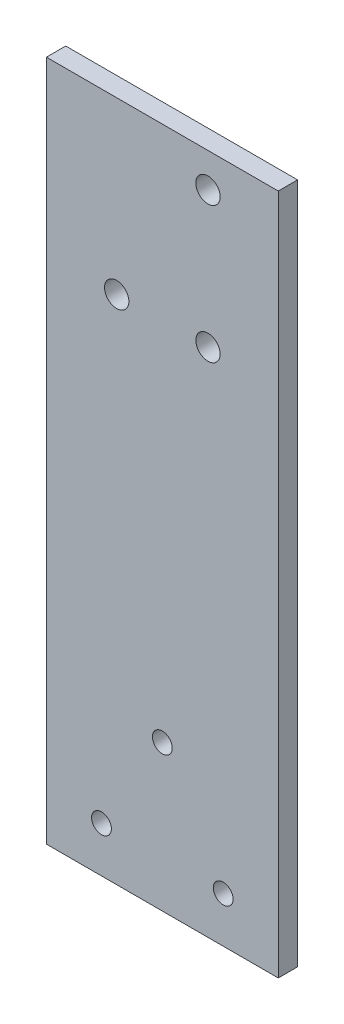
ISO-10303-21;
HEADER;
FILE_DESCRIPTION(('STEP AP214'),'2;1');
FILE_NAME('part.step','',(''),(''),'','','');
FILE_SCHEMA(('AUTOMOTIVE_DESIGN { 1 0 10303 214 1 1 1 1 }'));
ENDSEC;
DATA;
#1=APPLICATION_CONTEXT('core data for automotive mechanical design processes');
#2=APPLICATION_PROTOCOL_DEFINITION('international standard','automotive_design',2000,#1);
#3=PRODUCT_CONTEXT('',#1,'mechanical');
#4=PRODUCT('Part','Part','',(#3));
#5=PRODUCT_RELATED_PRODUCT_CATEGORY('part','',(#4));
#6=PRODUCT_DEFINITION_FORMATION('','',#4);
#7=PRODUCT_DEFINITION_CONTEXT('part definition',#1,'design');
#8=PRODUCT_DEFINITION('design','',#6,#7);
#9=PRODUCT_DEFINITION_SHAPE('','',#8);
#10=(LENGTH_UNIT() NAMED_UNIT(*) SI_UNIT(.MILLI.,.METRE.));
#11=(NAMED_UNIT(*) PLANE_ANGLE_UNIT() SI_UNIT($,.RADIAN.));
#12=(NAMED_UNIT(*) SI_UNIT($,.STERADIAN.) SOLID_ANGLE_UNIT());
#13=UNCERTAINTY_MEASURE_WITH_UNIT(LENGTH_MEASURE(1.E-05),#10,'distance_accuracy_value','');
#14=(GEOMETRIC_REPRESENTATION_CONTEXT(3) GLOBAL_UNCERTAINTY_ASSIGNED_CONTEXT((#13)) GLOBAL_UNIT_ASSIGNED_CONTEXT((#10,
#11,#12)) REPRESENTATION_CONTEXT('',''));
#15=CARTESIAN_POINT('',(0.,0.,0.));
#16=DIRECTION('',(0.,0.,1.));
#17=DIRECTION('',(1.,0.,0.));
#18=AXIS2_PLACEMENT_3D('',#15,#16,#17);
#19=CARTESIAN_POINT('',(0.,0.,6.35));
#20=DIRECTION('',(0.,0.,-1.));
#21=DIRECTION('',(-1.,0.,0.));
#22=AXIS2_PLACEMENT_3D('',#19,#20,#21);
#23=PLANE('',#22);
#24=CARTESIAN_POINT('',(18.1,15.,6.35));
#25=DIRECTION('',(0.,0.,1.));
#26=DIRECTION('',(1.,0.,0.));
#27=AXIS2_PLACEMENT_3D('',#24,#25,#26);
#28=CIRCLE('',#27,3.25);
#29=CARTESIAN_POINT('',(21.35,15.,6.35));
#30=VERTEX_POINT('',#29);
#31=EDGE_CURVE('E132',#30,#30,#28,.T.);
#32=ORIENTED_EDGE('',*,*,#31,.F.);
#33=EDGE_LOOP('',(#32));
#34=FACE_BOUND('',#33,.T.);
#35=CARTESIAN_POINT('',(38.1,48.,6.35));
#36=DIRECTION('',(0.,0.,1.));
#37=DIRECTION('',(1.,0.,0.));
#38=AXIS2_PLACEMENT_3D('',#35,#36,#37);
#39=CIRCLE('',#38,3.25);
#40=CARTESIAN_POINT('',(41.35,48.,6.35));
#41=VERTEX_POINT('',#40);
#42=EDGE_CURVE('E120',#41,#41,#39,.T.);
#43=ORIENTED_EDGE('',*,*,#42,.F.);
#44=EDGE_LOOP('',(#43));
#45=FACE_BOUND('',#44,.T.);
#46=CARTESIAN_POINT('',(23.1,168.,6.35));
#47=DIRECTION('',(0.,0.,1.));
#48=DIRECTION('',(1.,0.,0.));
#49=AXIS2_PLACEMENT_3D('',#46,#47,#48);
#50=CIRCLE('',#49,4.);
#51=CARTESIAN_POINT('',(27.1,168.,6.35));
#52=VERTEX_POINT('',#51);
#53=EDGE_CURVE('E99',#52,#52,#50,.T.);
#54=ORIENTED_EDGE('',*,*,#53,.F.);
#55=EDGE_LOOP('',(#54));
#56=FACE_BOUND('',#55,.T.);
#57=DIRECTION('',(0.,-1.,0.));
#58=VECTOR('',#57,1.);
#59=CARTESIAN_POINT('',(0.,0.,6.35));
#60=LINE('',#59,#58);
#61=CARTESIAN_POINT('',(0.,224.,6.35));
#62=VERTEX_POINT('',#61);
#63=CARTESIAN_POINT('',(0.,0.,6.35));
#64=VERTEX_POINT('',#63);
#65=EDGE_CURVE('E84',#62,#64,#60,.T.);
#66=ORIENTED_EDGE('',*,*,#65,.T.);
#67=DIRECTION('',(1.,0.,0.));
#68=VECTOR('',#67,1.);
#69=CARTESIAN_POINT('',(0.,0.,6.35));
#70=LINE('',#69,#68);
#71=CARTESIAN_POINT('',(76.2,0.,6.35));
#72=VERTEX_POINT('',#71);
#73=EDGE_CURVE('E79',#64,#72,#70,.T.);
#74=ORIENTED_EDGE('',*,*,#73,.T.);
#75=DIRECTION('',(0.,1.,0.));
#76=VECTOR('',#75,1.);
#77=CARTESIAN_POINT('',(76.2,0.,6.35));
#78=LINE('',#77,#76);
#79=CARTESIAN_POINT('',(76.1999999999999,224.,6.35));
#80=VERTEX_POINT('',#79);
#81=EDGE_CURVE('E82',#72,#80,#78,.T.);
#82=ORIENTED_EDGE('',*,*,#81,.T.);
#83=DIRECTION('',(-1.,0.,0.));
#84=VECTOR('',#83,1.);
#85=CARTESIAN_POINT('',(0.,224.,6.35));
#86=LINE('',#85,#84);
#87=EDGE_CURVE('E49',#80,#62,#86,.T.);
#88=ORIENTED_EDGE('',*,*,#87,.T.);
#89=EDGE_LOOP('',(#66,#74,#82,#88));
#90=FACE_BOUND('',#89,.T.);
#91=CARTESIAN_POINT('',(53.1,168.,6.35));
#92=DIRECTION('',(0.,0.,1.));
#93=DIRECTION('',(1.,0.,0.));
#94=AXIS2_PLACEMENT_3D('',#91,#92,#93);
#95=CIRCLE('',#94,4.00000000000001);
#96=CARTESIAN_POINT('',(57.1,168.,6.35));
#97=VERTEX_POINT('',#96);
#98=EDGE_CURVE('E114',#97,#97,#95,.T.);
#99=ORIENTED_EDGE('',*,*,#98,.F.);
#100=EDGE_LOOP('',(#99));
#101=FACE_BOUND('',#100,.T.);
#102=CARTESIAN_POINT('',(58.1,15.,6.35));
#103=DIRECTION('',(0.,0.,1.));
#104=DIRECTION('',(1.,0.,0.));
#105=AXIS2_PLACEMENT_3D('',#102,#103,#104);
#106=CIRCLE('',#105,3.25);
#107=CARTESIAN_POINT('',(61.35,15.,6.35));
#108=VERTEX_POINT('',#107);
#109=EDGE_CURVE('E126',#108,#108,#106,.T.);
#110=ORIENTED_EDGE('',*,*,#109,.F.);
#111=EDGE_LOOP('',(#110));
#112=FACE_BOUND('',#111,.T.);
#113=CARTESIAN_POINT('',(53.1,212.75,6.35));
#114=DIRECTION('',(0.,0.,1.));
#115=DIRECTION('',(1.,0.,0.));
#116=AXIS2_PLACEMENT_3D('',#113,#114,#115);
#117=CIRCLE('',#116,4.00000000000001);
#118=CARTESIAN_POINT('',(57.1,212.75,6.35));
#119=VERTEX_POINT('',#118);
#120=EDGE_CURVE('E138',#119,#119,#117,.T.);
#121=ORIENTED_EDGE('',*,*,#120,.F.);
#122=EDGE_LOOP('',(#121));
#123=FACE_BOUND('',#122,.T.);
#124=ADVANCED_FACE('F32',(#34,#45,#56,#90,#101,#112,#123),#23,.F.);
#125=CARTESIAN_POINT('',(0.,0.,0.));
#126=DIRECTION('',(0.,0.,-1.));
#127=DIRECTION('',(-1.,0.,0.));
#128=AXIS2_PLACEMENT_3D('',#125,#126,#127);
#129=PLANE('',#128);
#130=CARTESIAN_POINT('',(18.1,15.,0.));
#131=DIRECTION('',(0.,0.,1.));
#132=DIRECTION('',(1.,0.,0.));
#133=AXIS2_PLACEMENT_3D('',#130,#131,#132);
#134=CIRCLE('',#133,3.25);
#135=CARTESIAN_POINT('',(21.35,15.,0.));
#136=VERTEX_POINT('',#135);
#137=EDGE_CURVE('E135',#136,#136,#134,.T.);
#138=ORIENTED_EDGE('',*,*,#137,.T.);
#139=EDGE_LOOP('',(#138));
#140=FACE_BOUND('',#139,.T.);
#141=CARTESIAN_POINT('',(38.1,48.,0.));
#142=DIRECTION('',(0.,0.,1.));
#143=DIRECTION('',(1.,0.,0.));
#144=AXIS2_PLACEMENT_3D('',#141,#142,#143);
#145=CIRCLE('',#144,3.25);
#146=CARTESIAN_POINT('',(41.35,48.,0.));
#147=VERTEX_POINT('',#146);
#148=EDGE_CURVE('E123',#147,#147,#145,.T.);
#149=ORIENTED_EDGE('',*,*,#148,.T.);
#150=EDGE_LOOP('',(#149));
#151=FACE_BOUND('',#150,.T.);
#152=CARTESIAN_POINT('',(23.1,168.,0.));
#153=DIRECTION('',(0.,0.,1.));
#154=DIRECTION('',(1.,0.,0.));
#155=AXIS2_PLACEMENT_3D('',#152,#153,#154);
#156=CIRCLE('',#155,4.);
#157=CARTESIAN_POINT('',(27.1,168.,0.));
#158=VERTEX_POINT('',#157);
#159=EDGE_CURVE('E111',#158,#158,#156,.T.);
#160=ORIENTED_EDGE('',*,*,#159,.T.);
#161=EDGE_LOOP('',(#160));
#162=FACE_BOUND('',#161,.T.);
#163=DIRECTION('',(0.,-1.,0.));
#164=VECTOR('',#163,1.);
#165=CARTESIAN_POINT('',(0.,0.,0.));
#166=LINE('',#165,#164);
#167=CARTESIAN_POINT('',(0.,224.,0.));
#168=VERTEX_POINT('',#167);
#169=CARTESIAN_POINT('',(0.,0.,0.));
#170=VERTEX_POINT('',#169);
#171=EDGE_CURVE('E96',#168,#170,#166,.T.);
#172=ORIENTED_EDGE('',*,*,#171,.F.);
#173=DIRECTION('',(-1.,0.,0.));
#174=VECTOR('',#173,1.);
#175=CARTESIAN_POINT('',(0.,224.,0.));
#176=LINE('',#175,#174);
#177=CARTESIAN_POINT('',(76.1999999999999,224.,0.));
#178=VERTEX_POINT('',#177);
#179=EDGE_CURVE('E72',#178,#168,#176,.T.);
#180=ORIENTED_EDGE('',*,*,#179,.F.);
#181=DIRECTION('',(0.,1.,0.));
#182=VECTOR('',#181,1.);
#183=CARTESIAN_POINT('',(76.2,0.,0.));
#184=LINE('',#183,#182);
#185=CARTESIAN_POINT('',(76.2,0.,0.));
#186=VERTEX_POINT('',#185);
#187=EDGE_CURVE('E66',#186,#178,#184,.T.);
#188=ORIENTED_EDGE('',*,*,#187,.F.);
#189=DIRECTION('',(1.,0.,0.));
#190=VECTOR('',#189,1.);
#191=CARTESIAN_POINT('',(0.,0.,0.));
#192=LINE('',#191,#190);
#193=EDGE_CURVE('E88',#170,#186,#192,.T.);
#194=ORIENTED_EDGE('',*,*,#193,.F.);
#195=EDGE_LOOP('',(#172,#180,#188,#194));
#196=FACE_BOUND('',#195,.T.);
#197=CARTESIAN_POINT('',(53.1,168.,0.));
#198=DIRECTION('',(0.,0.,1.));
#199=DIRECTION('',(1.,0.,0.));
#200=AXIS2_PLACEMENT_3D('',#197,#198,#199);
#201=CIRCLE('',#200,4.00000000000001);
#202=CARTESIAN_POINT('',(57.1,168.,0.));
#203=VERTEX_POINT('',#202);
#204=EDGE_CURVE('E117',#203,#203,#201,.T.);
#205=ORIENTED_EDGE('',*,*,#204,.T.);
#206=EDGE_LOOP('',(#205));
#207=FACE_BOUND('',#206,.T.);
#208=CARTESIAN_POINT('',(58.1,15.,0.));
#209=DIRECTION('',(0.,0.,1.));
#210=DIRECTION('',(1.,0.,0.));
#211=AXIS2_PLACEMENT_3D('',#208,#209,#210);
#212=CIRCLE('',#211,3.25);
#213=CARTESIAN_POINT('',(61.35,15.,0.));
#214=VERTEX_POINT('',#213);
#215=EDGE_CURVE('E129',#214,#214,#212,.T.);
#216=ORIENTED_EDGE('',*,*,#215,.T.);
#217=EDGE_LOOP('',(#216));
#218=FACE_BOUND('',#217,.T.);
#219=CARTESIAN_POINT('',(53.1,212.75,0.));
#220=DIRECTION('',(0.,0.,1.));
#221=DIRECTION('',(1.,0.,0.));
#222=AXIS2_PLACEMENT_3D('',#219,#220,#221);
#223=CIRCLE('',#222,4.00000000000001);
#224=CARTESIAN_POINT('',(57.1,212.75,0.));
#225=VERTEX_POINT('',#224);
#226=EDGE_CURVE('E141',#225,#225,#223,.T.);
#227=ORIENTED_EDGE('',*,*,#226,.T.);
#228=EDGE_LOOP('',(#227));
#229=FACE_BOUND('',#228,.T.);
#230=ADVANCED_FACE('F107',(#140,#151,#162,#196,#207,#218,#229),#129,.T.);
#231=CARTESIAN_POINT('',(0.,0.,6.35));
#232=DIRECTION('',(1.,0.,0.));
#233=DIRECTION('',(0.,0.,-1.));
#234=AXIS2_PLACEMENT_3D('',#231,#232,#233);
#235=PLANE('',#234);
#236=ORIENTED_EDGE('',*,*,#171,.T.);
#237=DIRECTION('',(0.,0.,-1.));
#238=VECTOR('',#237,1.);
#239=CARTESIAN_POINT('',(0.,0.,6.35));
#240=LINE('',#239,#238);
#241=EDGE_CURVE('E11',#64,#170,#240,.T.);
#242=ORIENTED_EDGE('',*,*,#241,.F.);
#243=ORIENTED_EDGE('',*,*,#65,.F.);
#244=DIRECTION('',(0.,0.,-1.));
#245=VECTOR('',#244,1.);
#246=CARTESIAN_POINT('',(0.,224.,6.35));
#247=LINE('',#246,#245);
#248=EDGE_CURVE('E92',#62,#168,#247,.T.);
#249=ORIENTED_EDGE('',*,*,#248,.T.);
#250=EDGE_LOOP('',(#236,#242,#243,#249));
#251=FACE_BOUND('',#250,.T.);
#252=ADVANCED_FACE('F34',(#251),#235,.F.);
#253=CARTESIAN_POINT('',(0.,0.,6.35));
#254=DIRECTION('',(0.,1.,0.));
#255=DIRECTION('',(-1.,0.,0.));
#256=AXIS2_PLACEMENT_3D('',#253,#254,#255);
#257=PLANE('',#256);
#258=ORIENTED_EDGE('',*,*,#193,.T.);
#259=DIRECTION('',(0.,0.,-1.));
#260=VECTOR('',#259,1.);
#261=CARTESIAN_POINT('',(76.2,0.,6.35));
#262=LINE('',#261,#260);
#263=EDGE_CURVE('E41',#72,#186,#262,.T.);
#264=ORIENTED_EDGE('',*,*,#263,.F.);
#265=ORIENTED_EDGE('',*,*,#73,.F.);
#266=ORIENTED_EDGE('',*,*,#241,.T.);
#267=EDGE_LOOP('',(#258,#264,#265,#266));
#268=FACE_BOUND('',#267,.T.);
#269=ADVANCED_FACE('F87',(#268),#257,.F.);
#270=CARTESIAN_POINT('',(76.2,0.,6.35));
#271=DIRECTION('',(-1.,0.,0.));
#272=DIRECTION('',(0.,-1.,0.));
#273=AXIS2_PLACEMENT_3D('',#270,#271,#272);
#274=PLANE('',#273);
#275=ORIENTED_EDGE('',*,*,#187,.T.);
#276=DIRECTION('',(0.,0.,-1.));
#277=VECTOR('',#276,1.);
#278=CARTESIAN_POINT('',(76.1999999999999,224.,6.35));
#279=LINE('',#278,#277);
#280=EDGE_CURVE('E89',#80,#178,#279,.T.);
#281=ORIENTED_EDGE('',*,*,#280,.F.);
#282=ORIENTED_EDGE('',*,*,#81,.F.);
#283=ORIENTED_EDGE('',*,*,#263,.T.);
#284=EDGE_LOOP('',(#275,#281,#282,#283));
#285=FACE_BOUND('',#284,.T.);
#286=ADVANCED_FACE('F90',(#285),#274,.F.);
#287=CARTESIAN_POINT('',(0.,224.,6.35));
#288=DIRECTION('',(0.,-1.,0.));
#289=DIRECTION('',(0.,0.,-1.));
#290=AXIS2_PLACEMENT_3D('',#287,#288,#289);
#291=PLANE('',#290);
#292=ORIENTED_EDGE('',*,*,#179,.T.);
#293=ORIENTED_EDGE('',*,*,#248,.F.);
#294=ORIENTED_EDGE('',*,*,#87,.F.);
#295=ORIENTED_EDGE('',*,*,#280,.T.);
#296=EDGE_LOOP('',(#292,#293,#294,#295));
#297=FACE_BOUND('',#296,.T.);
#298=ADVANCED_FACE('F104',(#297),#291,.F.);
#299=CARTESIAN_POINT('',(23.1,168.,6.35));
#300=DIRECTION('',(0.,0.,-1.));
#301=DIRECTION('',(-1.,0.,0.));
#302=AXIS2_PLACEMENT_3D('',#299,#300,#301);
#303=CYLINDRICAL_SURFACE('',#302,4.);
#304=ORIENTED_EDGE('',*,*,#53,.T.);
#305=EDGE_LOOP('',(#304));
#306=FACE_BOUND('',#305,.T.);
#307=ORIENTED_EDGE('',*,*,#159,.F.);
#308=EDGE_LOOP('',(#307));
#309=FACE_BOUND('',#308,.T.);
#310=ADVANCED_FACE('F161',(#306,#309),#303,.F.);
#311=CARTESIAN_POINT('',(53.1,168.,6.35));
#312=DIRECTION('',(0.,0.,-1.));
#313=DIRECTION('',(-1.,0.,0.));
#314=AXIS2_PLACEMENT_3D('',#311,#312,#313);
#315=CYLINDRICAL_SURFACE('',#314,4.00000000000001);
#316=ORIENTED_EDGE('',*,*,#98,.T.);
#317=EDGE_LOOP('',(#316));
#318=FACE_BOUND('',#317,.T.);
#319=ORIENTED_EDGE('',*,*,#204,.F.);
#320=EDGE_LOOP('',(#319));
#321=FACE_BOUND('',#320,.T.);
#322=ADVANCED_FACE('F207',(#318,#321),#315,.F.);
#323=CARTESIAN_POINT('',(38.1,48.,6.35));
#324=DIRECTION('',(0.,0.,-1.));
#325=DIRECTION('',(-1.,0.,0.));
#326=AXIS2_PLACEMENT_3D('',#323,#324,#325);
#327=CYLINDRICAL_SURFACE('',#326,3.25);
#328=ORIENTED_EDGE('',*,*,#42,.T.);
#329=EDGE_LOOP('',(#328));
#330=FACE_BOUND('',#329,.T.);
#331=ORIENTED_EDGE('',*,*,#148,.F.);
#332=EDGE_LOOP('',(#331));
#333=FACE_BOUND('',#332,.T.);
#334=ADVANCED_FACE('F215',(#330,#333),#327,.F.);
#335=CARTESIAN_POINT('',(58.1,15.,6.35));
#336=DIRECTION('',(0.,0.,-1.));
#337=DIRECTION('',(-1.,0.,0.));
#338=AXIS2_PLACEMENT_3D('',#335,#336,#337);
#339=CYLINDRICAL_SURFACE('',#338,3.25);
#340=ORIENTED_EDGE('',*,*,#109,.T.);
#341=EDGE_LOOP('',(#340));
#342=FACE_BOUND('',#341,.T.);
#343=ORIENTED_EDGE('',*,*,#215,.F.);
#344=EDGE_LOOP('',(#343));
#345=FACE_BOUND('',#344,.T.);
#346=ADVANCED_FACE('F223',(#342,#345),#339,.F.);
#347=CARTESIAN_POINT('',(18.1,15.,6.35));
#348=DIRECTION('',(0.,0.,-1.));
#349=DIRECTION('',(-1.,0.,0.));
#350=AXIS2_PLACEMENT_3D('',#347,#348,#349);
#351=CYLINDRICAL_SURFACE('',#350,3.25);
#352=ORIENTED_EDGE('',*,*,#31,.T.);
#353=EDGE_LOOP('',(#352));
#354=FACE_BOUND('',#353,.T.);
#355=ORIENTED_EDGE('',*,*,#137,.F.);
#356=EDGE_LOOP('',(#355));
#357=FACE_BOUND('',#356,.T.);
#358=ADVANCED_FACE('F232',(#354,#357),#351,.F.);
#359=CARTESIAN_POINT('',(53.1,212.75,6.35));
#360=DIRECTION('',(0.,0.,-1.));
#361=DIRECTION('',(-1.,0.,0.));
#362=AXIS2_PLACEMENT_3D('',#359,#360,#361);
#363=CYLINDRICAL_SURFACE('',#362,4.00000000000001);
#364=ORIENTED_EDGE('',*,*,#120,.T.);
#365=EDGE_LOOP('',(#364));
#366=FACE_BOUND('',#365,.T.);
#367=ORIENTED_EDGE('',*,*,#226,.F.);
#368=EDGE_LOOP('',(#367));
#369=FACE_BOUND('',#368,.T.);
#370=ADVANCED_FACE('F147',(#366,#369),#363,.F.);
#371=CLOSED_SHELL('',(#124,#230,#252,#269,#286,#298,#310,#322,#334,#346,#358,#370));
#372=MANIFOLD_SOLID_BREP('B2',#371);
#373=ADVANCED_BREP_SHAPE_REPRESENTATION('',(#18,#372),#14);
#374=SHAPE_DEFINITION_REPRESENTATION(#9,#373);
ENDSEC;
END-ISO-10303-21;
